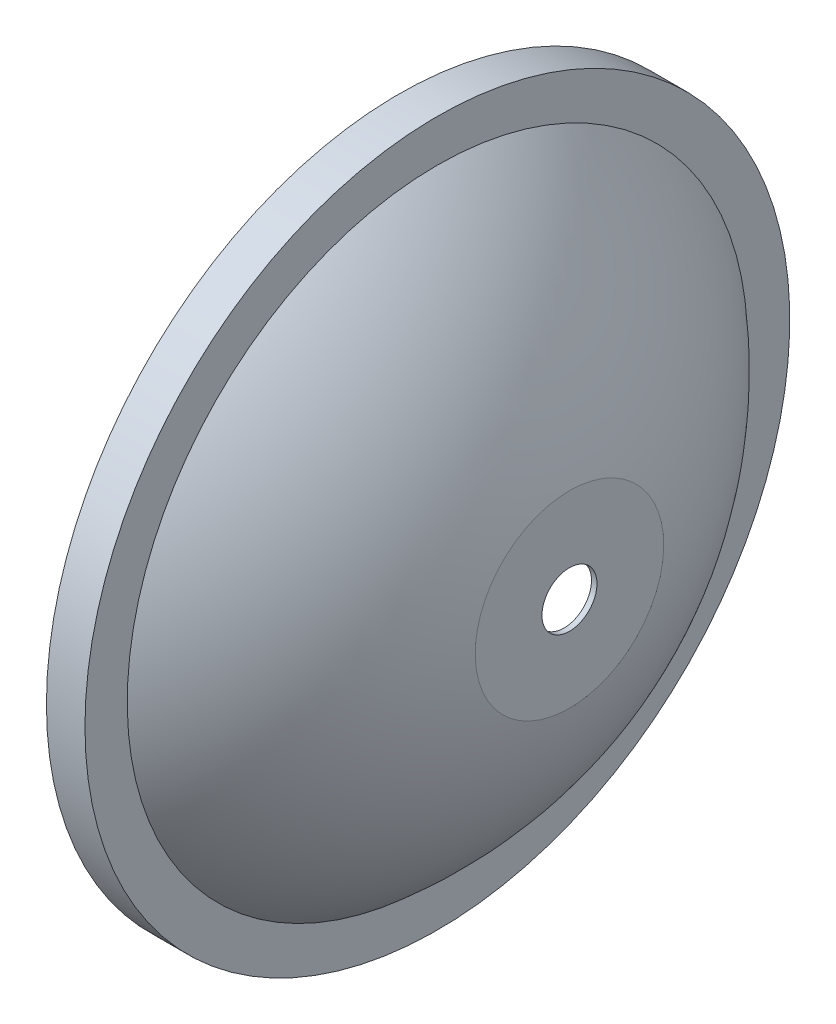
ISO-10303-21;
HEADER;
FILE_DESCRIPTION(('STEP AP214'),'2;1');
FILE_NAME('part.step','',(''),(''),'','','');
FILE_SCHEMA(('AUTOMOTIVE_DESIGN { 1 0 10303 214 1 1 1 1 }'));
ENDSEC;
DATA;
#1=APPLICATION_CONTEXT('core data for automotive mechanical design processes');
#2=APPLICATION_PROTOCOL_DEFINITION('international standard','automotive_design',2000,#1);
#3=PRODUCT_CONTEXT('',#1,'mechanical');
#4=PRODUCT('Part','Part','',(#3));
#5=PRODUCT_RELATED_PRODUCT_CATEGORY('part','',(#4));
#6=PRODUCT_DEFINITION_FORMATION('','',#4);
#7=PRODUCT_DEFINITION_CONTEXT('part definition',#1,'design');
#8=PRODUCT_DEFINITION('design','',#6,#7);
#9=PRODUCT_DEFINITION_SHAPE('','',#8);
#10=(LENGTH_UNIT() NAMED_UNIT(*) SI_UNIT(.MILLI.,.METRE.));
#11=(NAMED_UNIT(*) PLANE_ANGLE_UNIT() SI_UNIT($,.RADIAN.));
#12=(NAMED_UNIT(*) SI_UNIT($,.STERADIAN.) SOLID_ANGLE_UNIT());
#13=UNCERTAINTY_MEASURE_WITH_UNIT(LENGTH_MEASURE(1.E-05),#10,'distance_accuracy_value','');
#14=(GEOMETRIC_REPRESENTATION_CONTEXT(3) GLOBAL_UNCERTAINTY_ASSIGNED_CONTEXT((#13)) GLOBAL_UNIT_ASSIGNED_CONTEXT((#10,
#11,#12)) REPRESENTATION_CONTEXT('',''));
#15=CARTESIAN_POINT('',(0.,0.,0.));
#16=DIRECTION('',(0.,0.,1.));
#17=DIRECTION('',(1.,0.,0.));
#18=AXIS2_PLACEMENT_3D('',#15,#16,#17);
#19=CARTESIAN_POINT('',(-29.9929573971954,64.,0.));
#20=DIRECTION('',(1.,0.,0.));
#21=DIRECTION('',(0.,0.,-1.));
#22=AXIS2_PLACEMENT_3D('',#19,#20,#21);
#23=PLANE('',#22);
#24=CARTESIAN_POINT('',(-29.9929573971954,0.,0.));
#25=DIRECTION('',(-1.,0.,0.));
#26=DIRECTION('',(0.,0.,1.));
#27=AXIS2_PLACEMENT_3D('',#24,#25,#26);
#28=CIRCLE('',#27,63.);
#29=CARTESIAN_POINT('',(-29.9929573971954,0.,63.));
#30=VERTEX_POINT('',#29);
#31=EDGE_CURVE('E80',#30,#30,#28,.T.);
#32=ORIENTED_EDGE('',*,*,#31,.F.);
#33=EDGE_LOOP('',(#32));
#34=FACE_BOUND('',#33,.T.);
#35=CARTESIAN_POINT('',(-29.9929573971954,0.,0.));
#36=DIRECTION('',(-1.,0.,0.));
#37=DIRECTION('',(0.,0.,1.));
#38=AXIS2_PLACEMENT_3D('',#35,#36,#37);
#39=CIRCLE('',#38,64.);
#40=CARTESIAN_POINT('',(-29.9929573971954,0.,64.));
#41=VERTEX_POINT('',#40);
#42=EDGE_CURVE('E10',#41,#41,#39,.T.);
#43=ORIENTED_EDGE('',*,*,#42,.T.);
#44=EDGE_LOOP('',(#43));
#45=FACE_BOUND('',#44,.T.);
#46=ADVANCED_FACE('F37',(#34,#45),#23,.F.);
#47=CARTESIAN_POINT('',(0.,0.,0.));
#48=DIRECTION('',(-1.,0.,0.));
#49=DIRECTION('',(0.,0.,1.));
#50=AXIS2_PLACEMENT_3D('',#47,#48,#49);
#51=CYLINDRICAL_SURFACE('',#50,64.);
#52=ORIENTED_EDGE('',*,*,#42,.F.);
#53=EDGE_LOOP('',(#52));
#54=FACE_BOUND('',#53,.T.);
#55=CARTESIAN_POINT('',(-22.9929573971954,0.,0.));
#56=DIRECTION('',(-1.,0.,0.));
#57=DIRECTION('',(0.,0.,1.));
#58=AXIS2_PLACEMENT_3D('',#55,#56,#57);
#59=CIRCLE('',#58,64.);
#60=CARTESIAN_POINT('',(-22.9929573971954,0.,64.));
#61=VERTEX_POINT('',#60);
#62=EDGE_CURVE('E44',#61,#61,#59,.T.);
#63=ORIENTED_EDGE('',*,*,#62,.T.);
#64=EDGE_LOOP('',(#63));
#65=FACE_BOUND('',#64,.T.);
#66=ADVANCED_FACE('F88',(#54,#65),#51,.T.);
#67=CARTESIAN_POINT('',(-22.9929573971954,64.,0.));
#68=DIRECTION('',(-1.,0.,0.));
#69=DIRECTION('',(0.,0.,1.));
#70=AXIS2_PLACEMENT_3D('',#67,#68,#69);
#71=PLANE('',#70);
#72=ORIENTED_EDGE('',*,*,#62,.F.);
#73=EDGE_LOOP('',(#72));
#74=FACE_BOUND('',#73,.T.);
#75=CARTESIAN_POINT('',(-22.9929573971954,0.,0.));
#76=DIRECTION('',(-1.,0.,0.));
#77=DIRECTION('',(0.,0.,1.));
#78=AXIS2_PLACEMENT_3D('',#75,#76,#77);
#79=CIRCLE('',#78,56.3205113613149);
#80=CARTESIAN_POINT('',(-22.9929573971954,56.3205113613149,0.));
#81=VERTEX_POINT('',#80);
#82=EDGE_CURVE('E49',#81,#81,#79,.T.);
#83=ORIENTED_EDGE('',*,*,#82,.T.);
#84=EDGE_LOOP('',(#83));
#85=FACE_BOUND('',#84,.T.);
#86=ADVANCED_FACE('F92',(#74,#85),#71,.F.);
#87=CARTESIAN_POINT('',(-70.9929573971954,0.,0.));
#88=DIRECTION('',(-1.,0.,0.));
#89=DIRECTION('',(0.,1.,0.));
#90=AXIS2_PLACEMENT_3D('',#87,#88,#89);
#91=SPHERICAL_SURFACE('',#90,74.);
#92=CARTESIAN_POINT('',(1.,0.,0.));
#93=DIRECTION('',(-1.,0.,0.));
#94=DIRECTION('',(0.,0.,1.));
#95=AXIS2_PLACEMENT_3D('',#92,#93,#94);
#96=CIRCLE('',#95,17.1176541969281);
#97=CARTESIAN_POINT('',(1.,17.1176541969281,0.));
#98=VERTEX_POINT('',#97);
#99=EDGE_CURVE('E54',#98,#98,#96,.T.);
#100=CARTESIAN_POINT('',(-22.9929573971954,56.3205113613149,0.));
#101=CARTESIAN_POINT('',(-22.6224413895323,56.0047344228491,0.));
#102=CARTESIAN_POINT('',(-22.2550423613412,55.6853002306746,0.));
#103=CARTESIAN_POINT('',(-21.5266194076841,55.0392439667615,0.));
#104=CARTESIAN_POINT('',(-21.165595482218,54.7126218950229,0.));
#105=CARTESIAN_POINT('',(-20.4500638777918,54.0523164998345,0.));
#106=CARTESIAN_POINT('',(-20.0955561988317,53.7186331763848,0.));
#107=CARTESIAN_POINT('',(-19.3931950277699,53.044335406162,0.));
#108=CARTESIAN_POINT('',(-19.0453415356683,52.7037209593891,0.));
#109=CARTESIAN_POINT('',(-18.3564242651453,52.0156935695762,0.));
#110=CARTESIAN_POINT('',(-18.015360486724,51.6682806265364,0.));
#111=CARTESIAN_POINT('',(-17.340155478016,50.9667915731246,0.));
#112=CARTESIAN_POINT('',(-17.0060142477294,50.6127154627527,0.));
#113=CARTESIAN_POINT('',(-16.3447844862085,49.8980379844876,0.));
#114=CARTESIAN_POINT('',(-16.0176959549742,49.5374366165945,0.));
#115=CARTESIAN_POINT('',(-15.3706989920151,48.8098490785564,0.));
#116=CARTESIAN_POINT('',(-15.0507905602904,48.4428629084116,0.));
#117=CARTESIAN_POINT('',(-14.4182784010737,47.7026487069879,0.));
#118=CARTESIAN_POINT('',(-14.1056746735818,47.3294206757091,0.));
#119=CARTESIAN_POINT('',(-13.4878936821208,46.5768681246217,0.));
#120=CARTESIAN_POINT('',(-13.1827164181518,46.1975436048131,0.));
#121=CARTESIAN_POINT('',(-12.5799072204807,45.4329458237817,0.));
#122=CARTESIAN_POINT('',(-12.2822752867787,45.047672562559,0.));
#123=CARTESIAN_POINT('',(-11.6946726774573,44.2713273628735,0.));
#124=CARTESIAN_POINT('',(-11.4047020018379,43.8802554244107,0.));
#125=CARTESIAN_POINT('',(-10.8325348524376,43.0924651930021,0.));
#126=CARTESIAN_POINT('',(-10.5503383786566,42.6957469000563,0.));
#127=CARTESIAN_POINT('',(-9.99382954863118,41.8968184816986,0.));
#128=CARTESIAN_POINT('',(-9.7195171923867,41.4946083562868,0.));
#129=CARTESIAN_POINT('',(-9.17888344226409,40.6848529340856,0.));
#130=CARTESIAN_POINT('',(-8.91256204838597,40.2773076372964,0.));
#131=CARTESIAN_POINT('',(-8.38801395534113,39.4570406114817,0.));
#132=CARTESIAN_POINT('',(-8.1297872561744,39.0443188824563,0.));
#133=CARTESIAN_POINT('',(-7.62152913200893,38.2138597475342,0.));
#134=CARTESIAN_POINT('',(-7.37149770701019,37.7961223416375,0.));
#135=CARTESIAN_POINT('',(-6.87972751857295,36.9557945619466,0.));
#136=CARTESIAN_POINT('',(-6.63798875513446,36.5332041881525,0.));
#137=CARTESIAN_POINT('',(-6.16289804721329,35.6833350718747,0.));
#138=CARTESIAN_POINT('',(-5.92954610273061,35.2560563293911,0.));
#139=CARTESIAN_POINT('',(-5.47131992344547,34.3969769010648,0.));
#140=CARTESIAN_POINT('',(-5.246445688643,33.965176215222,0.));
#141=CARTESIAN_POINT('',(-4.80526251737,33.0972210868074,0.));
#142=CARTESIAN_POINT('',(-4.58895358089947,32.6610666442356,0.));
#143=CARTESIAN_POINT('',(-4.1649852587514,31.784573884784,0.));
#144=CARTESIAN_POINT('',(-3.95732587307385,31.3442355679043,0.));
#145=CARTESIAN_POINT('',(-3.55073753597434,30.4595465718783,0.));
#146=CARTESIAN_POINT('',(-3.35180858455238,30.015195892732,0.));
#147=CARTESIAN_POINT('',(-2.9627585988914,29.1226552470379,0.));
#148=CARTESIAN_POINT('',(-2.77263756465237,28.6744652804903,0.));
#149=CARTESIAN_POINT('',(-2.4012774656918,27.7744206302389,0.));
#150=CARTESIAN_POINT('',(-2.22003840097026,27.3225659465351,0.));
#151=CARTESIAN_POINT('',(-1.86651283348736,26.4153678597193,0.));
#152=CARTESIAN_POINT('',(-1.694226330726,25.9600244566072,0.));
#153=CARTESIAN_POINT('',(-1.35867299391867,25.0460262872338,0.));
#154=CARTESIAN_POINT('',(-1.1954061598727,24.5873715209726,0.));
#155=CARTESIAN_POINT('',(-0.877955749080872,23.6669292726327,0.));
#156=CARTESIAN_POINT('',(-0.723772172335014,23.2051417905541,0.));
#157=CARTESIAN_POINT('',(-0.424548345469187,22.2786139732743,0.));
#158=CARTESIAN_POINT('',(-0.279508095349218,21.8138736380731,0.));
#159=CARTESIAN_POINT('',(0.00137263996750369,20.8816211454133,0.));
#160=CARTESIAN_POINT('',(0.137213125164257,20.4141089879546,0.));
#161=CARTESIAN_POINT('',(0.399641215538045,19.4764948939743,0.));
#162=CARTESIAN_POINT('',(0.52622882071508,19.0063929574528,0.));
#163=CARTESIAN_POINT('',(0.770102610710882,18.0637826084172,0.));
#164=CARTESIAN_POINT('',(0.887388795529648,17.5912741959032,0.));
#165=CARTESIAN_POINT('',(1.,17.1176541969281,0.));
#166=B_SPLINE_CURVE_WITH_KNOTS('',3,(#100,#101,#102,#103,#104,#105,#106,#107,#108,#109,#110,
#111,#112,#113,#114,#115,#116,#117,#118,#119,#120,#121,#122,#123,#124,#125,#126,#127,#128,#129,
#130,#131,#132,#133,#134,#135,#136,#137,#138,#139,#140,#141,#142,#143,#144,#145,#146,#147,#148,
#149,#150,#151,#152,#153,#154,#155,#156,#157,#158,#159,#160,#161,#162,#163,#164,#165),
.UNSPECIFIED.,.F.,.F.,(4,2,2,2,2,2,2,2,2,2,2,2,2,2,2,2,2,2,2,2,2,2,2,2,2,2,2,2,2,2,2,2,4),(0.,
1.46044696389162,2.92089392778324,4.38134089167486,5.84178785556648,7.3022348194581,
8.76268178334973,10.2231287472413,11.683575711133,13.1440226750246,14.6044696389162,
16.0649166028078,17.5253635666994,18.9858105305911,20.4462574944827,21.9067044583743,
23.3671514222659,24.8275983861576,26.2880453500492,27.7484923139408,29.2089392778324,
30.669386241724,32.1298332056157,33.5902801695073,35.0507271333989,36.5111740972905,
37.9716210611821,39.4320680250737,40.8925149889654,42.352961952857,43.8134089167486,
45.2738558806402,46.7343028445318),.UNSPECIFIED.);
#167=EDGE_CURVE('BSEAM97',#81,#98,#166,.T.);
#168=ORIENTED_EDGE('',*,*,#82,.F.);
#169=ORIENTED_EDGE('',*,*,#99,.T.);
#170=ORIENTED_EDGE('',*,*,#167,.T.);
#171=ORIENTED_EDGE('',*,*,#167,.F.);
#172=EDGE_LOOP('',(#168,#170,#169,#171));
#173=FACE_BOUND('',#172,.T.);
#174=ADVANCED_FACE('F97',(#173),#91,.T.);
#175=CARTESIAN_POINT('',(1.,5.,0.));
#176=DIRECTION('',(-1.,0.,0.));
#177=DIRECTION('',(0.,0.,1.));
#178=AXIS2_PLACEMENT_3D('',#175,#176,#177);
#179=PLANE('',#178);
#180=ORIENTED_EDGE('',*,*,#99,.F.);
#181=EDGE_LOOP('',(#180));
#182=FACE_BOUND('',#181,.T.);
#183=CARTESIAN_POINT('',(1.,0.,0.));
#184=DIRECTION('',(-1.,0.,0.));
#185=DIRECTION('',(0.,0.,1.));
#186=AXIS2_PLACEMENT_3D('',#183,#184,#185);
#187=CIRCLE('',#186,5.);
#188=CARTESIAN_POINT('',(1.,0.,5.));
#189=VERTEX_POINT('',#188);
#190=EDGE_CURVE('E60',#189,#189,#187,.T.);
#191=ORIENTED_EDGE('',*,*,#190,.T.);
#192=EDGE_LOOP('',(#191));
#193=FACE_BOUND('',#192,.T.);
#194=ADVANCED_FACE('F103',(#182,#193),#179,.F.);
#195=CARTESIAN_POINT('',(0.,0.,0.));
#196=DIRECTION('',(-1.,0.,0.));
#197=DIRECTION('',(0.,0.,1.));
#198=AXIS2_PLACEMENT_3D('',#195,#196,#197);
#199=CYLINDRICAL_SURFACE('',#198,5.);
#200=ORIENTED_EDGE('',*,*,#190,.F.);
#201=EDGE_LOOP('',(#200));
#202=FACE_BOUND('',#201,.T.);
#203=CARTESIAN_POINT('',(0.,0.,0.));
#204=DIRECTION('',(-1.,0.,0.));
#205=DIRECTION('',(0.,0.,1.));
#206=AXIS2_PLACEMENT_3D('',#203,#204,#205);
#207=CIRCLE('',#206,5.);
#208=CARTESIAN_POINT('',(0.,0.,5.));
#209=VERTEX_POINT('',#208);
#210=EDGE_CURVE('E64',#209,#209,#207,.T.);
#211=ORIENTED_EDGE('',*,*,#210,.T.);
#212=EDGE_LOOP('',(#211));
#213=FACE_BOUND('',#212,.T.);
#214=ADVANCED_FACE('F107',(#202,#213),#199,.F.);
#215=CARTESIAN_POINT('',(0.,5.,0.));
#216=DIRECTION('',(1.,0.,0.));
#217=DIRECTION('',(0.,0.,-1.));
#218=AXIS2_PLACEMENT_3D('',#215,#216,#217);
#219=PLANE('',#218);
#220=ORIENTED_EDGE('',*,*,#210,.F.);
#221=EDGE_LOOP('',(#220));
#222=FACE_BOUND('',#221,.T.);
#223=CARTESIAN_POINT('',(0.,0.,0.));
#224=DIRECTION('',(-1.,0.,0.));
#225=DIRECTION('',(0.,0.,1.));
#226=AXIS2_PLACEMENT_3D('',#223,#224,#225);
#227=CIRCLE('',#226,17.);
#228=CARTESIAN_POINT('',(0.,16.9999999999999,0.));
#229=VERTEX_POINT('',#228);
#230=EDGE_CURVE('E68',#229,#229,#227,.T.);
#231=ORIENTED_EDGE('',*,*,#230,.T.);
#232=EDGE_LOOP('',(#231));
#233=FACE_BOUND('',#232,.T.);
#234=ADVANCED_FACE('F111',(#222,#233),#219,.F.);
#235=CARTESIAN_POINT('',(-70.9929573971954,0.,0.));
#236=DIRECTION('',(-1.,0.,0.));
#237=DIRECTION('',(0.,1.,0.));
#238=AXIS2_PLACEMENT_3D('',#235,#236,#237);
#239=SPHERICAL_SURFACE('',#238,73.);
#240=CARTESIAN_POINT('',(-23.9929573971954,0.,0.));
#241=DIRECTION('',(-1.,0.,0.));
#242=DIRECTION('',(0.,0.,1.));
#243=AXIS2_PLACEMENT_3D('',#240,#241,#242);
#244=CIRCLE('',#243,55.8569601750758);
#245=CARTESIAN_POINT('',(-23.9929573971954,55.8569601750758,0.));
#246=VERTEX_POINT('',#245);
#247=EDGE_CURVE('E72',#246,#246,#244,.T.);
#248=CARTESIAN_POINT('',(0.,16.9999999999999,0.));
#249=CARTESIAN_POINT('',(-0.112670572638858,17.4705215884801,0.));
#250=CARTESIAN_POINT('',(-0.230020169997329,17.9399227117786,0.));
#251=CARTESIAN_POINT('',(-0.474028120364973,18.8762992173911,0.));
#252=CARTESIAN_POINT('',(-0.600686473374147,19.3432745997053,0.));
#253=CARTESIAN_POINT('',(-0.863262641254734,20.2746148127283,0.));
#254=CARTESIAN_POINT('',(-0.999180456126147,20.7389796434373,0.));
#255=CARTESIAN_POINT('',(-1.28022160737402,21.6649152316034,0.));
#256=CARTESIAN_POINT('',(-1.42534494375048,22.1264859890606,0.));
#257=CARTESIAN_POINT('',(-1.72473982267244,23.0466509447988,0.));
#258=CARTESIAN_POINT('',(-1.87901136521794,23.5052451430799,0.));
#259=CARTESIAN_POINT('',(-2.19664165381384,24.4192756897042,0.));
#260=CARTESIAN_POINT('',(-2.36000039986424,24.8747120380474,0.));
#261=CARTESIAN_POINT('',(-2.6957405193586,25.7822468374741,0.));
#262=CARTESIAN_POINT('',(-2.86812189280255,26.2343452885577,0.));
#263=CARTESIAN_POINT('',(-3.22183911900176,27.1350255670288,0.));
#264=CARTESIAN_POINT('',(-3.40317497175702,27.5836073944164,0.));
#265=CARTESIAN_POINT('',(-3.77472946991123,28.4770770889205,0.));
#266=CARTESIAN_POINT('',(-3.96494811531018,28.9219649560371,0.));
#267=CARTESIAN_POINT('',(-4.35419300011166,29.8078708538415,0.));
#268=CARTESIAN_POINT('',(-4.55321923951419,30.2488888845293,0.));
#269=CARTESIAN_POINT('',(-4.9600006319009,31.1268807631436,0.));
#270=CARTESIAN_POINT('',(-5.16775578488509,31.5638546110702,0.));
#271=CARTESIAN_POINT('',(-5.59191287321193,32.4335853766109,0.));
#272=CARTESIAN_POINT('',(-5.8083148085546,32.8663422942251,0.));
#273=CARTESIAN_POINT('',(-6.24967991207589,33.7274681186545,0.));
#274=CARTESIAN_POINT('',(-6.47464308025452,34.1558370254698,0.));
#275=CARTESIAN_POINT('',(-6.93304171543699,35.0080174825143,0.));
#276=CARTESIAN_POINT('',(-7.16647718244084,35.4318290327436,0.));
#277=CARTESIAN_POINT('',(-7.64172813193515,36.274727232475,0.));
#278=CARTESIAN_POINT('',(-7.88354361442563,36.6938138819771,0.));
#279=CARTESIAN_POINT('',(-8.37545899870829,37.5270966039939,0.));
#280=CARTESIAN_POINT('',(-8.62555890050048,37.9412926765086,0.));
#281=CARTESIAN_POINT('',(-9.13394425214719,38.7646305016671,0.));
#282=CARTESIAN_POINT('',(-9.39222970200171,39.173772254311,0.));
#283=CARTESIAN_POINT('',(-9.91688404256567,39.9868396949536,0.));
#284=CARTESIAN_POINT('',(-10.1832529332751,40.3907653829523,0.));
#285=CARTESIAN_POINT('',(-10.7239688527392,41.1932410115815,0.));
#286=CARTESIAN_POINT('',(-10.9983158814939,41.5917909522119,0.));
#287=CARTESIAN_POINT('',(-11.5548796202656,42.3833575285592,0.));
#288=CARTESIAN_POINT('',(-11.8370963302826,42.7763741642762,0.));
#289=CARTESIAN_POINT('',(-12.4092878636989,43.5567187607157,0.));
#290=CARTESIAN_POINT('',(-12.6992626870981,43.9440467214383,0.));
#291=CARTESIAN_POINT('',(-13.2868558124061,44.7128608466967,0.));
#292=CARTESIAN_POINT('',(-13.5844741143149,45.0943470112324,0.));
#293=CARTESIAN_POINT('',(-14.1872365401005,45.8513267323385,0.));
#294=CARTESIAN_POINT('',(-14.4923806639774,46.2268202889088,0.));
#295=CARTESIAN_POINT('',(-15.1100741019797,46.9716663513658,0.));
#296=CARTESIAN_POINT('',(-15.4226234161051,47.3410188572524,0.));
#297=CARTESIAN_POINT('',(-16.0550036754797,48.0734368032703,0.));
#298=CARTESIAN_POINT('',(-16.374834620729,48.4365022434017,0.));
#299=CARTESIAN_POINT('',(-17.0216517043532,49.1562025285683,0.));
#300=CARTESIAN_POINT('',(-17.348637842728,49.5128373736035,0.));
#301=CARTESIAN_POINT('',(-18.0096360468915,50.2195354803657,0.));
#302=CARTESIAN_POINT('',(-18.3436481126801,50.5695987420928,0.));
#303=CARTESIAN_POINT('',(-19.0185661249594,51.2630152959021,0.));
#304=CARTESIAN_POINT('',(-19.3594720714501,51.6063685879843,0.));
#305=CARTESIAN_POINT('',(-20.0480430860019,52.2862294540536,0.));
#306=CARTESIAN_POINT('',(-20.3957081540629,52.6227370280408,0.));
#307=CARTESIAN_POINT('',(-21.0976599323541,53.2887734707984,0.));
#308=CARTESIAN_POINT('',(-21.4519466425842,53.6183023395688,0.));
#309=CARTESIAN_POINT('',(-22.1670017880071,54.2702509382611,0.));
#310=CARTESIAN_POINT('',(-22.5277702232,54.592670668183,0.));
#311=CARTESIAN_POINT('',(-23.2556456675121,55.230274132472,0.));
#312=CARTESIAN_POINT('',(-23.6227526766313,55.5454578668391,0.));
#313=CARTESIAN_POINT('',(-23.9929573971954,55.8569601750758,0.));
#314=B_SPLINE_CURVE_WITH_KNOTS('',3,(#248,#249,#250,#251,#252,#253,#254,#255,#256,#257,#258,
#259,#260,#261,#262,#263,#264,#265,#266,#267,#268,#269,#270,#271,#272,#273,#274,#275,#276,#277,
#278,#279,#280,#281,#282,#283,#284,#285,#286,#287,#288,#289,#290,#291,#292,#293,#294,#295,#296,
#297,#298,#299,#300,#301,#302,#303,#304,#305,#306,#307,#308,#309,#310,#311,#312,#313),
.UNSPECIFIED.,.F.,.F.,(4,2,2,2,2,2,2,2,2,2,2,2,2,2,2,2,2,2,2,2,2,2,2,2,2,2,2,2,2,2,2,2,4),(0.,
1.45144668774807,2.90289337549614,4.3543400632442,5.80578675099229,7.25723343874036,
8.70868012648843,10.1601268142365,11.6115735019846,13.0630201897326,14.5144668774807,
15.9659135652288,17.4173602529769,18.8688069407249,20.320253628473,21.7717003162211,
23.2231470039691,24.6745936917172,26.1260403794653,27.5774870672134,29.0289337549614,
30.4803804427095,31.9318271304576,33.3832738182056,34.8347205059537,36.2861671937018,
37.7376138814498,39.1890605691979,40.640507256946,42.0919539446941,43.5434006324421,
44.9948473201902,46.4462940079383),.UNSPECIFIED.);
#315=EDGE_CURVE('BSEAM115',#229,#246,#314,.T.);
#316=ORIENTED_EDGE('',*,*,#230,.F.);
#317=ORIENTED_EDGE('',*,*,#247,.T.);
#318=ORIENTED_EDGE('',*,*,#315,.T.);
#319=ORIENTED_EDGE('',*,*,#315,.F.);
#320=EDGE_LOOP('',(#316,#318,#317,#319));
#321=FACE_BOUND('',#320,.T.);
#322=ADVANCED_FACE('F115',(#321),#239,.F.);
#323=CARTESIAN_POINT('',(-23.9929573971954,63.,0.));
#324=DIRECTION('',(1.,0.,0.));
#325=DIRECTION('',(0.,0.,-1.));
#326=AXIS2_PLACEMENT_3D('',#323,#324,#325);
#327=PLANE('',#326);
#328=ORIENTED_EDGE('',*,*,#247,.F.);
#329=EDGE_LOOP('',(#328));
#330=FACE_BOUND('',#329,.T.);
#331=CARTESIAN_POINT('',(-23.9929573971954,0.,0.));
#332=DIRECTION('',(-1.,0.,0.));
#333=DIRECTION('',(0.,0.,1.));
#334=AXIS2_PLACEMENT_3D('',#331,#332,#333);
#335=CIRCLE('',#334,63.);
#336=CARTESIAN_POINT('',(-23.9929573971954,0.,63.));
#337=VERTEX_POINT('',#336);
#338=EDGE_CURVE('E76',#337,#337,#335,.T.);
#339=ORIENTED_EDGE('',*,*,#338,.T.);
#340=EDGE_LOOP('',(#339));
#341=FACE_BOUND('',#340,.T.);
#342=ADVANCED_FACE('F119',(#330,#341),#327,.F.);
#343=CARTESIAN_POINT('',(0.,0.,0.));
#344=DIRECTION('',(-1.,0.,0.));
#345=DIRECTION('',(0.,0.,1.));
#346=AXIS2_PLACEMENT_3D('',#343,#344,#345);
#347=CYLINDRICAL_SURFACE('',#346,63.);
#348=ORIENTED_EDGE('',*,*,#338,.F.);
#349=EDGE_LOOP('',(#348));
#350=FACE_BOUND('',#349,.T.);
#351=ORIENTED_EDGE('',*,*,#31,.T.);
#352=EDGE_LOOP('',(#351));
#353=FACE_BOUND('',#352,.T.);
#354=ADVANCED_FACE('F85',(#350,#353),#347,.F.);
#355=CLOSED_SHELL('',(#46,#66,#86,#174,#194,#214,#234,#322,#342,#354));
#356=MANIFOLD_SOLID_BREP('B2',#355);
#357=ADVANCED_BREP_SHAPE_REPRESENTATION('',(#18,#356),#14);
#358=SHAPE_DEFINITION_REPRESENTATION(#9,#357);
ENDSEC;
END-ISO-10303-21;
